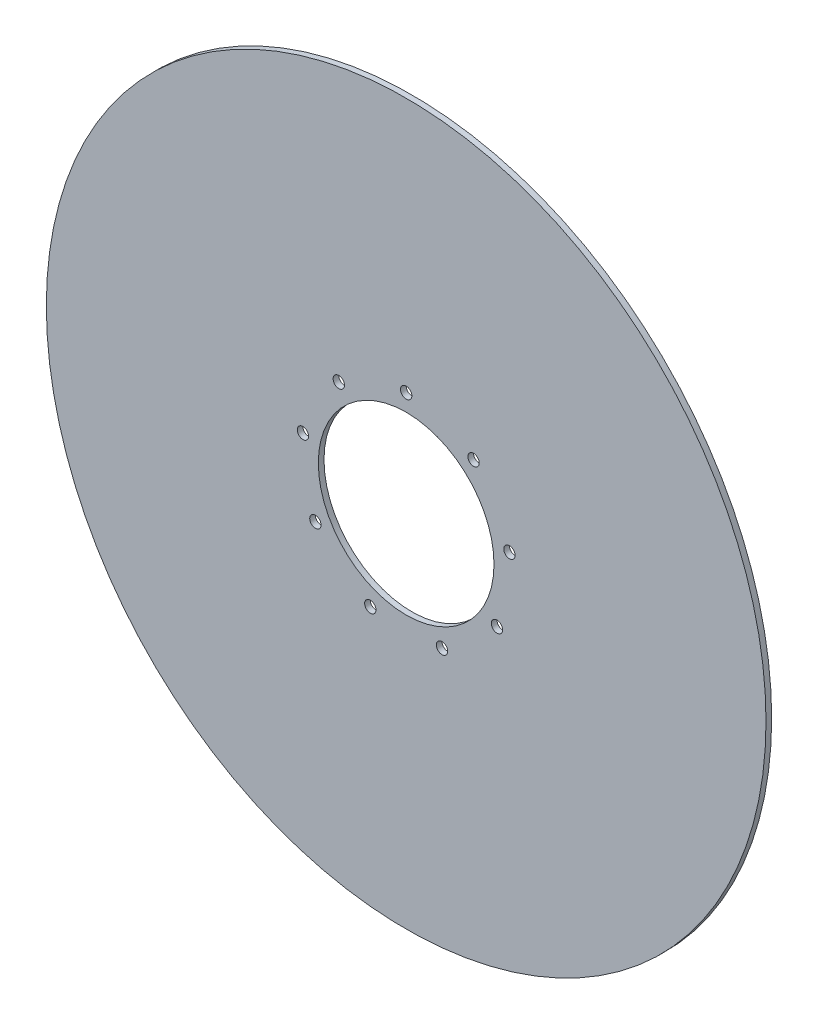
ISO-10303-21;
HEADER;
FILE_DESCRIPTION(('STEP AP214'),'2;1');
FILE_NAME('part.step','',(''),(''),'','','');
FILE_SCHEMA(('AUTOMOTIVE_DESIGN { 1 0 10303 214 1 1 1 1 }'));
ENDSEC;
DATA;
#1=APPLICATION_CONTEXT('core data for automotive mechanical design processes');
#2=APPLICATION_PROTOCOL_DEFINITION('international standard','automotive_design',2000,#1);
#3=PRODUCT_CONTEXT('',#1,'mechanical');
#4=PRODUCT('Part','Part','',(#3));
#5=PRODUCT_RELATED_PRODUCT_CATEGORY('part','',(#4));
#6=PRODUCT_DEFINITION_FORMATION('','',#4);
#7=PRODUCT_DEFINITION_CONTEXT('part definition',#1,'design');
#8=PRODUCT_DEFINITION('design','',#6,#7);
#9=PRODUCT_DEFINITION_SHAPE('','',#8);
#10=(LENGTH_UNIT() NAMED_UNIT(*) SI_UNIT(.MILLI.,.METRE.));
#11=(NAMED_UNIT(*) PLANE_ANGLE_UNIT() SI_UNIT($,.RADIAN.));
#12=(NAMED_UNIT(*) SI_UNIT($,.STERADIAN.) SOLID_ANGLE_UNIT());
#13=UNCERTAINTY_MEASURE_WITH_UNIT(LENGTH_MEASURE(1.E-05),#10,'distance_accuracy_value','');
#14=(GEOMETRIC_REPRESENTATION_CONTEXT(3) GLOBAL_UNCERTAINTY_ASSIGNED_CONTEXT((#13)) GLOBAL_UNIT_ASSIGNED_CONTEXT((#10,
#11,#12)) REPRESENTATION_CONTEXT('',''));
#15=CARTESIAN_POINT('',(0.,0.,0.));
#16=DIRECTION('',(0.,0.,1.));
#17=DIRECTION('',(1.,0.,0.));
#18=AXIS2_PLACEMENT_3D('',#15,#16,#17);
#19=CARTESIAN_POINT('',(0.,0.,-5.));
#20=DIRECTION('',(0.,0.,1.));
#21=DIRECTION('',(1.,0.,0.));
#22=AXIS2_PLACEMENT_3D('',#19,#20,#21);
#23=CYLINDRICAL_SURFACE('',#22,317.5);
#24=CARTESIAN_POINT('',(0.,0.,-5.));
#25=DIRECTION('',(0.,0.,1.));
#26=DIRECTION('',(1.,0.,0.));
#27=AXIS2_PLACEMENT_3D('',#24,#25,#26);
#28=CIRCLE('',#27,317.5);
#29=CARTESIAN_POINT('',(317.5,0.,-5.));
#30=VERTEX_POINT('',#29);
#31=EDGE_CURVE('E10',#30,#30,#28,.T.);
#32=ORIENTED_EDGE('',*,*,#31,.T.);
#33=EDGE_LOOP('',(#32));
#34=FACE_BOUND('',#33,.T.);
#35=CARTESIAN_POINT('',(0.,0.,0.));
#36=DIRECTION('',(0.,0.,1.));
#37=DIRECTION('',(1.,0.,0.));
#38=AXIS2_PLACEMENT_3D('',#35,#36,#37);
#39=CIRCLE('',#38,317.5);
#40=CARTESIAN_POINT('',(317.5,0.,0.));
#41=VERTEX_POINT('',#40);
#42=EDGE_CURVE('E42',#41,#41,#39,.T.);
#43=ORIENTED_EDGE('',*,*,#42,.F.);
#44=EDGE_LOOP('',(#43));
#45=FACE_BOUND('',#44,.T.);
#46=ADVANCED_FACE('F35',(#34,#45),#23,.T.);
#47=CARTESIAN_POINT('',(0.,0.,-5.));
#48=DIRECTION('',(0.,0.,1.));
#49=DIRECTION('',(1.,0.,0.));
#50=AXIS2_PLACEMENT_3D('',#47,#48,#49);
#51=PLANE('',#50);
#52=CARTESIAN_POINT('',(-59.457853896004,70.8591109885062,-5.));
#53=DIRECTION('',(0.,0.,-1.));
#54=DIRECTION('',(-0.766044443118986,-0.64278760968653,0.));
#55=AXIS2_PLACEMENT_3D('',#52,#53,#54);
#56=CIRCLE('',#55,5.);
#57=CARTESIAN_POINT('',(-63.288076111599,67.6451729400736,-5.));
#58=VERTEX_POINT('',#57);
#59=EDGE_CURVE('E94',#58,#58,#56,.T.);
#60=ORIENTED_EDGE('',*,*,#59,.F.);
#61=EDGE_LOOP('',(#60));
#62=FACE_BOUND('',#61,.T.);
#63=CARTESIAN_POINT('',(-91.0947171536291,16.062456434192,-5.));
#64=DIRECTION('',(0.,0.,-1.));
#65=DIRECTION('',(-0.17364817766694,-0.984807753012206,0.));
#66=AXIS2_PLACEMENT_3D('',#63,#64,#65);
#67=CIRCLE('',#66,5.);
#68=CARTESIAN_POINT('',(-91.9629580419638,11.138417669131,-5.));
#69=VERTEX_POINT('',#68);
#70=EDGE_CURVE('E84',#69,#69,#67,.T.);
#71=ORIENTED_EDGE('',*,*,#70,.F.);
#72=EDGE_LOOP('',(#71));
#73=FACE_BOUND('',#72,.T.);
#74=CARTESIAN_POINT('',(-80.107349850061,-46.2499999999993,-5.));
#75=DIRECTION('',(0.,0.,-1.));
#76=DIRECTION('',(0.499999999999992,-0.866025403784443,0.));
#77=AXIS2_PLACEMENT_3D('',#74,#75,#76);
#78=CIRCLE('',#77,5.);
#79=CARTESIAN_POINT('',(-77.607349850061,-50.5801270189215,-5.));
#80=VERTEX_POINT('',#79);
#81=EDGE_CURVE('E81',#80,#80,#78,.T.);
#82=ORIENTED_EDGE('',*,*,#81,.F.);
#83=EDGE_LOOP('',(#82));
#84=FACE_BOUND('',#83,.T.);
#85=CARTESIAN_POINT('',(-31.636863257625,-86.9215674226963,-5.));
#86=DIRECTION('',(0.,0.,-1.));
#87=DIRECTION('',(0.939692620785906,-0.342020143325676,0.));
#88=AXIS2_PLACEMENT_3D('',#85,#86,#87);
#89=CIRCLE('',#88,5.);
#90=CARTESIAN_POINT('',(-26.9384001536955,-88.6316681393247,-5.));
#91=VERTEX_POINT('',#90);
#92=EDGE_CURVE('E78',#91,#91,#89,.T.);
#93=ORIENTED_EDGE('',*,*,#92,.F.);
#94=EDGE_LOOP('',(#93));
#95=FACE_BOUND('',#94,.T.);
#96=CARTESIAN_POINT('',(31.6368632576238,-86.9215674226967,-5.));
#97=DIRECTION('',(0.,0.,-1.));
#98=DIRECTION('',(0.939692620785911,0.342020143325663,0.));
#99=AXIS2_PLACEMENT_3D('',#96,#97,#98);
#100=CIRCLE('',#99,5.);
#101=CARTESIAN_POINT('',(36.3353263615534,-85.2114667060684,-5.));
#102=VERTEX_POINT('',#101);
#103=EDGE_CURVE('E74',#102,#102,#100,.T.);
#104=ORIENTED_EDGE('',*,*,#103,.F.);
#105=EDGE_LOOP('',(#104));
#106=FACE_BOUND('',#105,.T.);
#107=CARTESIAN_POINT('',(80.1073498500604,-46.2500000000004,-5.));
#108=DIRECTION('',(0.,0.,-1.));
#109=DIRECTION('',(0.500000000000004,0.866025403784436,0.));
#110=AXIS2_PLACEMENT_3D('',#107,#108,#109);
#111=CIRCLE('',#110,5.);
#112=CARTESIAN_POINT('',(82.6073498500604,-41.9198729810782,-5.));
#113=VERTEX_POINT('',#112);
#114=EDGE_CURVE('E70',#113,#113,#111,.T.);
#115=ORIENTED_EDGE('',*,*,#114,.F.);
#116=EDGE_LOOP('',(#115));
#117=FACE_BOUND('',#116,.T.);
#118=CARTESIAN_POINT('',(91.0947171536293,16.0624564341908,-5.));
#119=DIRECTION('',(0.,0.,-1.));
#120=DIRECTION('',(-0.173648177666927,0.984807753012209,0.));
#121=AXIS2_PLACEMENT_3D('',#118,#119,#120);
#122=CIRCLE('',#121,5.);
#123=CARTESIAN_POINT('',(90.2264762652947,20.9864951992518,-5.));
#124=VERTEX_POINT('',#123);
#125=EDGE_CURVE('E66',#124,#124,#122,.T.);
#126=ORIENTED_EDGE('',*,*,#125,.F.);
#127=EDGE_LOOP('',(#126));
#128=FACE_BOUND('',#127,.T.);
#129=CARTESIAN_POINT('',(59.457853896005,70.8591109885054,-5.));
#130=DIRECTION('',(0.,0.,-1.));
#131=DIRECTION('',(-0.766044443118977,0.642787609686541,0.));
#132=AXIS2_PLACEMENT_3D('',#129,#130,#131);
#133=CIRCLE('',#132,5.);
#134=CARTESIAN_POINT('',(55.6276316804101,74.0730490369381,-5.));
#135=VERTEX_POINT('',#134);
#136=EDGE_CURVE('E62',#135,#135,#133,.T.);
#137=ORIENTED_EDGE('',*,*,#136,.F.);
#138=EDGE_LOOP('',(#137));
#139=FACE_BOUND('',#138,.T.);
#140=CARTESIAN_POINT('',(0.,92.5,-5.));
#141=DIRECTION('',(0.,0.,-1.));
#142=DIRECTION('',(-1.,0.,0.));
#143=AXIS2_PLACEMENT_3D('',#140,#141,#142);
#144=CIRCLE('',#143,5.);
#145=CARTESIAN_POINT('',(-5.,92.5,-5.));
#146=VERTEX_POINT('',#145);
#147=EDGE_CURVE('E58',#146,#146,#144,.T.);
#148=ORIENTED_EDGE('',*,*,#147,.F.);
#149=EDGE_LOOP('',(#148));
#150=FACE_BOUND('',#149,.T.);
#151=CARTESIAN_POINT('',(0.,0.,-5.));
#152=DIRECTION('',(0.,0.,-1.));
#153=DIRECTION('',(-1.,0.,0.));
#154=AXIS2_PLACEMENT_3D('',#151,#152,#153);
#155=CIRCLE('',#154,77.5);
#156=CARTESIAN_POINT('',(-77.5,0.,-5.));
#157=VERTEX_POINT('',#156);
#158=EDGE_CURVE('E50',#157,#157,#155,.T.);
#159=ORIENTED_EDGE('',*,*,#158,.F.);
#160=EDGE_LOOP('',(#159));
#161=FACE_BOUND('',#160,.T.);
#162=ORIENTED_EDGE('',*,*,#31,.F.);
#163=EDGE_LOOP('',(#162));
#164=FACE_BOUND('',#163,.T.);
#165=ADVANCED_FACE('F111',(#62,#73,#84,#95,#106,#117,#128,#139,#150,#161,#164),#51,.F.);
#166=CARTESIAN_POINT('',(0.,0.,0.));
#167=DIRECTION('',(0.,0.,1.));
#168=DIRECTION('',(1.,0.,0.));
#169=AXIS2_PLACEMENT_3D('',#166,#167,#168);
#170=PLANE('',#169);
#171=CARTESIAN_POINT('',(-59.457853896004,70.8591109885062,0.));
#172=DIRECTION('',(0.,0.,1.));
#173=DIRECTION('',(1.,0.,0.));
#174=AXIS2_PLACEMENT_3D('',#171,#172,#173);
#175=CIRCLE('',#174,5.);
#176=CARTESIAN_POINT('',(-54.457853896004,70.8591109885062,0.));
#177=VERTEX_POINT('',#176);
#178=EDGE_CURVE('E38',#177,#177,#175,.T.);
#179=ORIENTED_EDGE('',*,*,#178,.F.);
#180=EDGE_LOOP('',(#179));
#181=FACE_BOUND('',#180,.T.);
#182=CARTESIAN_POINT('',(-91.0947171536291,16.062456434192,0.));
#183=DIRECTION('',(0.,0.,1.));
#184=DIRECTION('',(1.,0.,0.));
#185=AXIS2_PLACEMENT_3D('',#182,#183,#184);
#186=CIRCLE('',#185,5.);
#187=CARTESIAN_POINT('',(-86.0947171536291,16.062456434192,0.));
#188=VERTEX_POINT('',#187);
#189=EDGE_CURVE('E82',#188,#188,#186,.T.);
#190=ORIENTED_EDGE('',*,*,#189,.F.);
#191=EDGE_LOOP('',(#190));
#192=FACE_BOUND('',#191,.T.);
#193=CARTESIAN_POINT('',(-80.107349850061,-46.2499999999993,0.));
#194=DIRECTION('',(0.,0.,1.));
#195=DIRECTION('',(1.,0.,0.));
#196=AXIS2_PLACEMENT_3D('',#193,#194,#195);
#197=CIRCLE('',#196,5.);
#198=CARTESIAN_POINT('',(-75.107349850061,-46.2499999999993,0.));
#199=VERTEX_POINT('',#198);
#200=EDGE_CURVE('E79',#199,#199,#197,.T.);
#201=ORIENTED_EDGE('',*,*,#200,.F.);
#202=EDGE_LOOP('',(#201));
#203=FACE_BOUND('',#202,.T.);
#204=CARTESIAN_POINT('',(-31.636863257625,-86.9215674226963,0.));
#205=DIRECTION('',(0.,0.,1.));
#206=DIRECTION('',(1.,0.,0.));
#207=AXIS2_PLACEMENT_3D('',#204,#205,#206);
#208=CIRCLE('',#207,5.);
#209=CARTESIAN_POINT('',(-26.636863257625,-86.9215674226963,0.));
#210=VERTEX_POINT('',#209);
#211=EDGE_CURVE('E75',#210,#210,#208,.T.);
#212=ORIENTED_EDGE('',*,*,#211,.F.);
#213=EDGE_LOOP('',(#212));
#214=FACE_BOUND('',#213,.T.);
#215=CARTESIAN_POINT('',(31.6368632576238,-86.9215674226967,0.));
#216=DIRECTION('',(0.,0.,1.));
#217=DIRECTION('',(1.,0.,0.));
#218=AXIS2_PLACEMENT_3D('',#215,#216,#217);
#219=CIRCLE('',#218,5.);
#220=CARTESIAN_POINT('',(36.6368632576238,-86.9215674226967,0.));
#221=VERTEX_POINT('',#220);
#222=EDGE_CURVE('E71',#221,#221,#219,.T.);
#223=ORIENTED_EDGE('',*,*,#222,.F.);
#224=EDGE_LOOP('',(#223));
#225=FACE_BOUND('',#224,.T.);
#226=CARTESIAN_POINT('',(80.1073498500604,-46.2500000000004,0.));
#227=DIRECTION('',(0.,0.,1.));
#228=DIRECTION('',(1.,0.,0.));
#229=AXIS2_PLACEMENT_3D('',#226,#227,#228);
#230=CIRCLE('',#229,5.);
#231=CARTESIAN_POINT('',(85.1073498500604,-46.2500000000004,0.));
#232=VERTEX_POINT('',#231);
#233=EDGE_CURVE('E67',#232,#232,#230,.T.);
#234=ORIENTED_EDGE('',*,*,#233,.F.);
#235=EDGE_LOOP('',(#234));
#236=FACE_BOUND('',#235,.T.);
#237=CARTESIAN_POINT('',(91.0947171536293,16.0624564341908,0.));
#238=DIRECTION('',(0.,0.,1.));
#239=DIRECTION('',(1.,0.,0.));
#240=AXIS2_PLACEMENT_3D('',#237,#238,#239);
#241=CIRCLE('',#240,5.);
#242=CARTESIAN_POINT('',(96.0947171536293,16.0624564341908,0.));
#243=VERTEX_POINT('',#242);
#244=EDGE_CURVE('E63',#243,#243,#241,.T.);
#245=ORIENTED_EDGE('',*,*,#244,.F.);
#246=EDGE_LOOP('',(#245));
#247=FACE_BOUND('',#246,.T.);
#248=CARTESIAN_POINT('',(59.457853896005,70.8591109885054,0.));
#249=DIRECTION('',(0.,0.,1.));
#250=DIRECTION('',(1.,0.,0.));
#251=AXIS2_PLACEMENT_3D('',#248,#249,#250);
#252=CIRCLE('',#251,5.);
#253=CARTESIAN_POINT('',(64.457853896005,70.8591109885054,0.));
#254=VERTEX_POINT('',#253);
#255=EDGE_CURVE('E59',#254,#254,#252,.T.);
#256=ORIENTED_EDGE('',*,*,#255,.F.);
#257=EDGE_LOOP('',(#256));
#258=FACE_BOUND('',#257,.T.);
#259=CARTESIAN_POINT('',(0.,92.5,0.));
#260=DIRECTION('',(0.,0.,1.));
#261=DIRECTION('',(1.,0.,0.));
#262=AXIS2_PLACEMENT_3D('',#259,#260,#261);
#263=CIRCLE('',#262,5.);
#264=CARTESIAN_POINT('',(5.,92.5,0.));
#265=VERTEX_POINT('',#264);
#266=EDGE_CURVE('E55',#265,#265,#263,.T.);
#267=ORIENTED_EDGE('',*,*,#266,.F.);
#268=EDGE_LOOP('',(#267));
#269=FACE_BOUND('',#268,.T.);
#270=CARTESIAN_POINT('',(0.,0.,0.));
#271=DIRECTION('',(0.,0.,1.));
#272=DIRECTION('',(1.,0.,0.));
#273=AXIS2_PLACEMENT_3D('',#270,#271,#272);
#274=CIRCLE('',#273,77.5);
#275=CARTESIAN_POINT('',(77.5,0.,0.));
#276=VERTEX_POINT('',#275);
#277=EDGE_CURVE('E47',#276,#276,#274,.T.);
#278=ORIENTED_EDGE('',*,*,#277,.F.);
#279=EDGE_LOOP('',(#278));
#280=FACE_BOUND('',#279,.T.);
#281=ORIENTED_EDGE('',*,*,#42,.T.);
#282=EDGE_LOOP('',(#281));
#283=FACE_BOUND('',#282,.T.);
#284=ADVANCED_FACE('F114',(#181,#192,#203,#214,#225,#236,#247,#258,#269,#280,#283),#170,.T.);
#285=CARTESIAN_POINT('',(0.,0.,5.));
#286=DIRECTION('',(0.,0.,-1.));
#287=DIRECTION('',(-1.,0.,0.));
#288=AXIS2_PLACEMENT_3D('',#285,#286,#287);
#289=CYLINDRICAL_SURFACE('',#288,77.5);
#290=ORIENTED_EDGE('',*,*,#277,.T.);
#291=EDGE_LOOP('',(#290));
#292=FACE_BOUND('',#291,.T.);
#293=ORIENTED_EDGE('',*,*,#158,.T.);
#294=EDGE_LOOP('',(#293));
#295=FACE_BOUND('',#294,.T.);
#296=ADVANCED_FACE('F121',(#292,#295),#289,.F.);
#297=CARTESIAN_POINT('',(0.,92.5,5.));
#298=DIRECTION('',(0.,0.,-1.));
#299=DIRECTION('',(-1.,0.,0.));
#300=AXIS2_PLACEMENT_3D('',#297,#298,#299);
#301=CYLINDRICAL_SURFACE('',#300,5.);
#302=ORIENTED_EDGE('',*,*,#266,.T.);
#303=EDGE_LOOP('',(#302));
#304=FACE_BOUND('',#303,.T.);
#305=ORIENTED_EDGE('',*,*,#147,.T.);
#306=EDGE_LOOP('',(#305));
#307=FACE_BOUND('',#306,.T.);
#308=ADVANCED_FACE('F109',(#304,#307),#301,.F.);
#309=CARTESIAN_POINT('',(59.457853896005,70.8591109885054,5.));
#310=DIRECTION('',(0.,0.,-1.));
#311=DIRECTION('',(-1.,0.,0.));
#312=AXIS2_PLACEMENT_3D('',#309,#310,#311);
#313=CYLINDRICAL_SURFACE('',#312,5.);
#314=ORIENTED_EDGE('',*,*,#255,.T.);
#315=EDGE_LOOP('',(#314));
#316=FACE_BOUND('',#315,.T.);
#317=ORIENTED_EDGE('',*,*,#136,.T.);
#318=EDGE_LOOP('',(#317));
#319=FACE_BOUND('',#318,.T.);
#320=ADVANCED_FACE('F129',(#316,#319),#313,.F.);
#321=CARTESIAN_POINT('',(91.0947171536293,16.0624564341908,5.));
#322=DIRECTION('',(0.,0.,-1.));
#323=DIRECTION('',(-1.,0.,0.));
#324=AXIS2_PLACEMENT_3D('',#321,#322,#323);
#325=CYLINDRICAL_SURFACE('',#324,5.);
#326=ORIENTED_EDGE('',*,*,#244,.T.);
#327=EDGE_LOOP('',(#326));
#328=FACE_BOUND('',#327,.T.);
#329=ORIENTED_EDGE('',*,*,#125,.T.);
#330=EDGE_LOOP('',(#329));
#331=FACE_BOUND('',#330,.T.);
#332=ADVANCED_FACE('F159',(#328,#331),#325,.F.);
#333=CARTESIAN_POINT('',(80.1073498500604,-46.2500000000004,5.));
#334=DIRECTION('',(0.,0.,-1.));
#335=DIRECTION('',(-1.,0.,0.));
#336=AXIS2_PLACEMENT_3D('',#333,#334,#335);
#337=CYLINDRICAL_SURFACE('',#336,5.);
#338=ORIENTED_EDGE('',*,*,#233,.T.);
#339=EDGE_LOOP('',(#338));
#340=FACE_BOUND('',#339,.T.);
#341=ORIENTED_EDGE('',*,*,#114,.T.);
#342=EDGE_LOOP('',(#341));
#343=FACE_BOUND('',#342,.T.);
#344=ADVANCED_FACE('F171',(#340,#343),#337,.F.);
#345=CARTESIAN_POINT('',(31.6368632576238,-86.9215674226967,5.));
#346=DIRECTION('',(0.,0.,-1.));
#347=DIRECTION('',(-1.,0.,0.));
#348=AXIS2_PLACEMENT_3D('',#345,#346,#347);
#349=CYLINDRICAL_SURFACE('',#348,5.);
#350=ORIENTED_EDGE('',*,*,#222,.T.);
#351=EDGE_LOOP('',(#350));
#352=FACE_BOUND('',#351,.T.);
#353=ORIENTED_EDGE('',*,*,#103,.T.);
#354=EDGE_LOOP('',(#353));
#355=FACE_BOUND('',#354,.T.);
#356=ADVANCED_FACE('F182',(#352,#355),#349,.F.);
#357=CARTESIAN_POINT('',(-31.636863257625,-86.9215674226963,5.));
#358=DIRECTION('',(0.,0.,-1.));
#359=DIRECTION('',(-1.,0.,0.));
#360=AXIS2_PLACEMENT_3D('',#357,#358,#359);
#361=CYLINDRICAL_SURFACE('',#360,5.);
#362=ORIENTED_EDGE('',*,*,#211,.T.);
#363=EDGE_LOOP('',(#362));
#364=FACE_BOUND('',#363,.T.);
#365=ORIENTED_EDGE('',*,*,#92,.T.);
#366=EDGE_LOOP('',(#365));
#367=FACE_BOUND('',#366,.T.);
#368=ADVANCED_FACE('F193',(#364,#367),#361,.F.);
#369=CARTESIAN_POINT('',(-80.107349850061,-46.2499999999993,5.));
#370=DIRECTION('',(0.,0.,-1.));
#371=DIRECTION('',(-1.,0.,0.));
#372=AXIS2_PLACEMENT_3D('',#369,#370,#371);
#373=CYLINDRICAL_SURFACE('',#372,5.);
#374=ORIENTED_EDGE('',*,*,#200,.T.);
#375=EDGE_LOOP('',(#374));
#376=FACE_BOUND('',#375,.T.);
#377=ORIENTED_EDGE('',*,*,#81,.T.);
#378=EDGE_LOOP('',(#377));
#379=FACE_BOUND('',#378,.T.);
#380=ADVANCED_FACE('F204',(#376,#379),#373,.F.);
#381=CARTESIAN_POINT('',(-91.0947171536291,16.062456434192,5.));
#382=DIRECTION('',(0.,0.,-1.));
#383=DIRECTION('',(-1.,0.,0.));
#384=AXIS2_PLACEMENT_3D('',#381,#382,#383);
#385=CYLINDRICAL_SURFACE('',#384,5.);
#386=ORIENTED_EDGE('',*,*,#189,.T.);
#387=EDGE_LOOP('',(#386));
#388=FACE_BOUND('',#387,.T.);
#389=ORIENTED_EDGE('',*,*,#70,.T.);
#390=EDGE_LOOP('',(#389));
#391=FACE_BOUND('',#390,.T.);
#392=ADVANCED_FACE('F215',(#388,#391),#385,.F.);
#393=CARTESIAN_POINT('',(-59.457853896004,70.8591109885062,5.));
#394=DIRECTION('',(0.,0.,-1.));
#395=DIRECTION('',(-1.,0.,0.));
#396=AXIS2_PLACEMENT_3D('',#393,#394,#395);
#397=CYLINDRICAL_SURFACE('',#396,5.);
#398=ORIENTED_EDGE('',*,*,#178,.T.);
#399=EDGE_LOOP('',(#398));
#400=FACE_BOUND('',#399,.T.);
#401=ORIENTED_EDGE('',*,*,#59,.T.);
#402=EDGE_LOOP('',(#401));
#403=FACE_BOUND('',#402,.T.);
#404=ADVANCED_FACE('F226',(#400,#403),#397,.F.);
#405=CLOSED_SHELL('',(#46,#165,#284,#296,#308,#320,#332,#344,#356,#368,#380,#392,#404));
#406=MANIFOLD_SOLID_BREP('B2',#405);
#407=ADVANCED_BREP_SHAPE_REPRESENTATION('',(#18,#406),#14);
#408=SHAPE_DEFINITION_REPRESENTATION(#9,#407);
ENDSEC;
END-ISO-10303-21;
